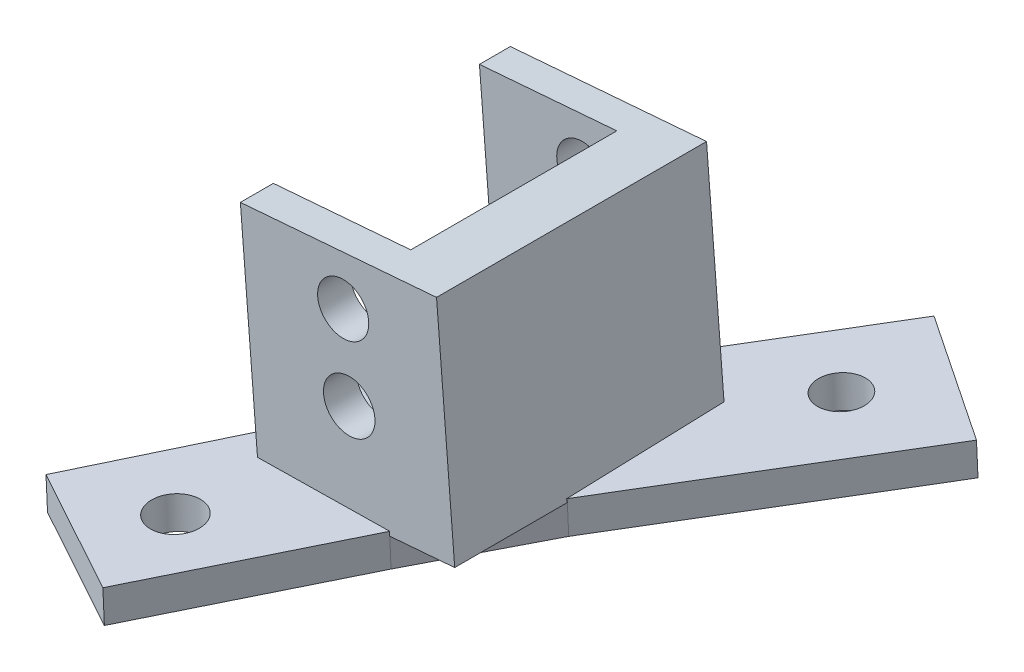
ISO-10303-21;
HEADER;
FILE_DESCRIPTION(('STEP AP214'),'2;1');
FILE_NAME('part.step','',(''),(''),'','','');
FILE_SCHEMA(('AUTOMOTIVE_DESIGN { 1 0 10303 214 1 1 1 1 }'));
ENDSEC;
DATA;
#1=APPLICATION_CONTEXT('core data for automotive mechanical design processes');
#2=APPLICATION_PROTOCOL_DEFINITION('international standard','automotive_design',2000,#1);
#3=PRODUCT_CONTEXT('',#1,'mechanical');
#4=PRODUCT('Part','Part','',(#3));
#5=PRODUCT_RELATED_PRODUCT_CATEGORY('part','',(#4));
#6=PRODUCT_DEFINITION_FORMATION('','',#4);
#7=PRODUCT_DEFINITION_CONTEXT('part definition',#1,'design');
#8=PRODUCT_DEFINITION('design','',#6,#7);
#9=PRODUCT_DEFINITION_SHAPE('','',#8);
#10=(LENGTH_UNIT() NAMED_UNIT(*) SI_UNIT(.MILLI.,.METRE.));
#11=(NAMED_UNIT(*) PLANE_ANGLE_UNIT() SI_UNIT($,.RADIAN.));
#12=(NAMED_UNIT(*) SI_UNIT($,.STERADIAN.) SOLID_ANGLE_UNIT());
#13=UNCERTAINTY_MEASURE_WITH_UNIT(LENGTH_MEASURE(1.E-05),#10,'distance_accuracy_value','');
#14=(GEOMETRIC_REPRESENTATION_CONTEXT(3) GLOBAL_UNCERTAINTY_ASSIGNED_CONTEXT((#13)) GLOBAL_UNIT_ASSIGNED_CONTEXT((#10,
#11,#12)) REPRESENTATION_CONTEXT('',''));
#15=CARTESIAN_POINT('',(0.,0.,0.));
#16=DIRECTION('',(0.,0.,1.));
#17=DIRECTION('',(1.,0.,0.));
#18=AXIS2_PLACEMENT_3D('',#15,#16,#17);
#19=CARTESIAN_POINT('',(-18.1904457725648,225.404163788834,-29.21));
#20=DIRECTION('',(0.0804399463844192,-0.996759456953217,0.));
#21=DIRECTION('',(0.996759456953217,0.0804399463844192,0.));
#22=AXIS2_PLACEMENT_3D('',#19,#20,#21);
#23=PLANE('',#22);
#24=DIRECTION('',(0.490806979567559,0.0396088412767035,-0.870367536446809));
#25=VECTOR('',#24,1.);
#26=CARTESIAN_POINT('',(-142.63849989162,215.361023760265,-99.8442643999821));
#27=LINE('',#26,#25);
#28=CARTESIAN_POINT('',(-196.807644056723,210.989494579443,-3.7839667246044));
#29=VERTEX_POINT('',#28);
#30=CARTESIAN_POINT('',(-182.469707413053,212.146587042258,-29.21));
#31=VERTEX_POINT('',#30);
#32=EDGE_CURVE('E292',#29,#31,#27,.T.);
#33=ORIENTED_EDGE('',*,*,#32,.F.);
#34=DIRECTION('',(0.,0.,1.));
#35=VECTOR('',#34,1.);
#36=CARTESIAN_POINT('',(-196.807644056723,210.989494579443,-29.21));
#37=LINE('',#36,#35);
#38=CARTESIAN_POINT('',(-196.807644056723,210.989494579443,-29.21));
#39=VERTEX_POINT('',#38);
#40=EDGE_CURVE('E389',#39,#29,#37,.T.);
#41=ORIENTED_EDGE('',*,*,#40,.F.);
#42=DIRECTION('',(0.996759456953217,0.0804399463844192,0.));
#43=VECTOR('',#42,1.);
#44=CARTESIAN_POINT('',(-18.1904457725648,225.404163788834,-29.21));
#45=LINE('',#44,#43);
#46=EDGE_CURVE('E360',#39,#31,#45,.T.);
#47=ORIENTED_EDGE('',*,*,#46,.T.);
#48=EDGE_LOOP('',(#33,#41,#47));
#49=FACE_BOUND('',#48,.T.);
#50=ADVANCED_FACE('F47',(#49),#23,.T.);
#51=CARTESIAN_POINT('',(-174.291632788432,229.541137280801,-29.21));
#52=DIRECTION('',(0.,0.,1.));
#53=DIRECTION('',(1.,0.,0.));
#54=AXIS2_PLACEMENT_3D('',#51,#52,#53);
#55=CYLINDRICAL_SURFACE('',#54,5.0800000000001);
#56=CARTESIAN_POINT('',(-174.291632788432,229.541137280801,-25.4000000000002));
#57=DIRECTION('',(0.,0.,1.));
#58=DIRECTION('',(0.,-1.,0.));
#59=AXIS2_PLACEMENT_3D('',#56,#57,#58);
#60=CIRCLE('',#59,5.08000000000002);
#61=CARTESIAN_POINT('',(-179.097761141606,231.186594740846,-25.4000000000002));
#62=VERTEX_POINT('',#61);
#63=CARTESIAN_POINT('',(-178.8037688076,227.207250277425,-25.4000000000002));
#64=VERTEX_POINT('',#63);
#65=EDGE_CURVE('E318',#62,#64,#60,.T.);
#66=ORIENTED_EDGE('',*,*,#65,.T.);
#67=DIRECTION('',(0.,0.,1.));
#68=VECTOR('',#67,1.);
#69=CARTESIAN_POINT('',(-178.8037688076,227.207250277425,-29.21));
#70=LINE('',#69,#68);
#71=CARTESIAN_POINT('',(-178.8037688076,227.207250277425,0.));
#72=VERTEX_POINT('',#71);
#73=EDGE_CURVE('E369',#64,#72,#70,.T.);
#74=ORIENTED_EDGE('',*,*,#73,.T.);
#75=CARTESIAN_POINT('',(-174.291632788432,229.541137280801,0.));
#76=DIRECTION('',(0.,0.,1.));
#77=DIRECTION('',(1.,0.,0.));
#78=AXIS2_PLACEMENT_3D('',#75,#76,#77);
#79=CIRCLE('',#78,5.0800000000001);
#80=CARTESIAN_POINT('',(-179.097761141606,231.186594740846,0.));
#81=VERTEX_POINT('',#80);
#82=EDGE_CURVE('E356',#81,#72,#79,.T.);
#83=ORIENTED_EDGE('',*,*,#82,.F.);
#84=DIRECTION('',(0.,0.,1.));
#85=VECTOR('',#84,1.);
#86=CARTESIAN_POINT('',(-179.097761141606,231.186594740846,-29.21));
#87=LINE('',#86,#85);
#88=EDGE_CURVE('E380',#62,#81,#87,.T.);
#89=ORIENTED_EDGE('',*,*,#88,.F.);
#90=EDGE_LOOP('',(#66,#74,#83,#89));
#91=FACE_BOUND('',#90,.T.);
#92=ADVANCED_FACE('F49',(#91),#55,.T.);
#93=CARTESIAN_POINT('',(-186.372442080017,233.677201969771,-29.21));
#94=DIRECTION('',(0.,0.,1.));
#95=DIRECTION('',(1.,0.,0.));
#96=AXIS2_PLACEMENT_3D('',#93,#94,#95);
#97=CYLINDRICAL_SURFACE('',#96,7.68922018961971);
#98=CARTESIAN_POINT('',(-186.372442080017,233.677201969771,-25.4000000000001));
#99=DIRECTION('',(0.,0.,1.));
#100=DIRECTION('',(0.,-1.,0.));
#101=AXIS2_PLACEMENT_3D('',#98,#99,#100);
#102=CIRCLE('',#101,7.68922018961969);
#103=CARTESIAN_POINT('',(-182.112910704482,240.07880329954,-25.4000000000001));
#104=VERTEX_POINT('',#103);
#105=EDGE_CURVE('E70',#104,#62,#102,.F.);
#106=ORIENTED_EDGE('',*,*,#105,.T.);
#107=ORIENTED_EDGE('',*,*,#88,.T.);
#108=CARTESIAN_POINT('',(-186.372442080017,233.677201969771,0.));
#109=DIRECTION('',(0.,0.,1.));
#110=DIRECTION('',(1.,0.,0.));
#111=AXIS2_PLACEMENT_3D('',#108,#109,#110);
#112=CIRCLE('',#111,7.68922018961971);
#113=CARTESIAN_POINT('',(-182.112910704482,240.07880329954,0.));
#114=VERTEX_POINT('',#113);
#115=EDGE_CURVE('E361',#114,#81,#112,.F.);
#116=ORIENTED_EDGE('',*,*,#115,.F.);
#117=DIRECTION('',(0.,0.,1.));
#118=VECTOR('',#117,1.);
#119=CARTESIAN_POINT('',(-182.112910704482,240.07880329954,-29.21));
#120=LINE('',#119,#118);
#121=EDGE_CURVE('E383',#104,#114,#120,.T.);
#122=ORIENTED_EDGE('',*,*,#121,.F.);
#123=EDGE_LOOP('',(#106,#107,#116,#122));
#124=FACE_BOUND('',#123,.T.);
#125=ADVANCED_FACE('F472',(#124),#97,.F.);
#126=CARTESIAN_POINT('',(-20.4277220013547,253.127034565074,-29.21));
#127=DIRECTION('',(-0.0804399463844192,0.996759456953217,0.));
#128=DIRECTION('',(-0.996759456953217,-0.0804399463844192,0.));
#129=AXIS2_PLACEMENT_3D('',#126,#127,#128);
#130=PLANE('',#129);
#131=DIRECTION('',(-0.996759456953217,-0.0804399463844192,0.));
#132=VECTOR('',#131,1.);
#133=CARTESIAN_POINT('',(-20.4277220013547,253.127034565074,-29.21));
#134=LINE('',#133,#132);
#135=CARTESIAN_POINT('',(-174.867675228012,240.663504401901,-29.21));
#136=VERTEX_POINT('',#135);
#137=CARTESIAN_POINT('',(-199.044920285513,238.712365355683,-29.21));
#138=VERTEX_POINT('',#137);
#139=EDGE_CURVE('E366',#136,#138,#134,.T.);
#140=ORIENTED_EDGE('',*,*,#139,.T.);
#141=DIRECTION('',(0.,0.,-1.));
#142=VECTOR('',#141,1.);
#143=CARTESIAN_POINT('',(-199.044920285513,238.712365355683,7.34351507594975));
#144=LINE('',#143,#142);
#145=CARTESIAN_POINT('',(-199.044920285513,238.712365355683,-25.4000000000002));
#146=VERTEX_POINT('',#145);
#147=EDGE_CURVE('E301',#146,#138,#144,.T.);
#148=ORIENTED_EDGE('',*,*,#147,.F.);
#149=DIRECTION('',(0.996759456953217,0.080439946384421,0.));
#150=VECTOR('',#149,1.);
#151=CARTESIAN_POINT('',(-199.044920285513,238.712365355683,-25.4000000000001));
#152=LINE('',#151,#150);
#153=EDGE_CURVE('E314',#146,#104,#152,.T.);
#154=ORIENTED_EDGE('',*,*,#153,.T.);
#155=ORIENTED_EDGE('',*,*,#121,.T.);
#156=DIRECTION('',(-0.996759456953217,-0.0804399463844201,0.));
#157=VECTOR('',#156,1.);
#158=CARTESIAN_POINT('',(-174.867675228012,240.663504401901,0.));
#159=LINE('',#158,#157);
#160=CARTESIAN_POINT('',(-199.044920285513,238.712365355683,0.));
#161=VERTEX_POINT('',#160);
#162=EDGE_CURVE('E334',#114,#161,#159,.T.);
#163=ORIENTED_EDGE('',*,*,#162,.T.);
#164=DIRECTION('',(0.,0.,-1.));
#165=VECTOR('',#164,1.);
#166=CARTESIAN_POINT('',(-199.044920285513,238.712365355683,4.06400000000001));
#167=LINE('',#166,#165);
#168=CARTESIAN_POINT('',(-199.044920285513,238.712365355683,4.06400000000001));
#169=VERTEX_POINT('',#168);
#170=EDGE_CURVE('E350',#169,#161,#167,.T.);
#171=ORIENTED_EDGE('',*,*,#170,.F.);
#172=DIRECTION('',(-0.996759456953217,-0.0804399463844201,0.));
#173=VECTOR('',#172,1.);
#174=CARTESIAN_POINT('',(-174.867675228012,240.663504401901,4.06400000000001));
#175=LINE('',#174,#173);
#176=CARTESIAN_POINT('',(-174.867675228012,240.663504401901,4.06400000000001));
#177=VERTEX_POINT('',#176);
#178=EDGE_CURVE('E337',#177,#169,#175,.T.);
#179=ORIENTED_EDGE('',*,*,#178,.F.);
#180=DIRECTION('',(0.,0.,1.));
#181=VECTOR('',#180,1.);
#182=CARTESIAN_POINT('',(-174.867675228012,240.663504401901,-29.21));
#183=LINE('',#182,#181);
#184=EDGE_CURVE('E385',#136,#177,#183,.T.);
#185=ORIENTED_EDGE('',*,*,#184,.F.);
#186=EDGE_LOOP('',(#140,#148,#154,#155,#163,#171,#179,#185));
#187=FACE_BOUND('',#186,.T.);
#188=ADVANCED_FACE('F423',(#187),#130,.T.);
#189=CARTESIAN_POINT('',(-154.439953226657,-12.463530163173,-29.21));
#190=DIRECTION('',(0.996759456953217,0.0804399463844184,0.));
#191=DIRECTION('',(-0.0804399463844184,0.996759456953217,0.));
#192=AXIS2_PLACEMENT_3D('',#189,#190,#191);
#193=PLANE('',#192);
#194=DIRECTION('',(0.0796348507072536,-0.986783235361383,-0.14112808707892));
#195=VECTOR('',#194,1.);
#196=CARTESIAN_POINT('',(-154.584338943718,-10.6743963385198,-41.8012951545538));
#197=LINE('',#196,#195);
#198=CARTESIAN_POINT('',(-172.664286142816,213.360541051816,-9.76019329983422));
#199=VERTEX_POINT('',#198);
#200=CARTESIAN_POINT('',(-172.630398999222,212.940633625661,-9.82024775726713));
#201=VERTEX_POINT('',#200);
#202=EDGE_CURVE('E290',#199,#201,#197,.T.);
#203=ORIENTED_EDGE('',*,*,#202,.F.);
#204=DIRECTION('',(-0.00245015527146717,0.0303607293093839,-0.999536003781228));
#205=VECTOR('',#204,1.);
#206=CARTESIAN_POINT('',(-172.695010957906,213.74126296153,-22.2943209325871));
#207=LINE('',#206,#205);
#208=CARTESIAN_POINT('',(-172.711963311257,213.951325489905,-29.21));
#209=VERTEX_POINT('',#208);
#210=EDGE_CURVE('E285',#199,#209,#207,.T.);
#211=ORIENTED_EDGE('',*,*,#210,.T.);
#212=DIRECTION('',(-0.0804399463844184,0.996759456953217,0.));
#213=VECTOR('',#212,1.);
#214=CARTESIAN_POINT('',(-154.439953226657,-12.463530163173,-29.21));
#215=LINE('',#214,#213);
#216=EDGE_CURVE('E364',#209,#136,#215,.T.);
#217=ORIENTED_EDGE('',*,*,#216,.T.);
#218=ORIENTED_EDGE('',*,*,#184,.T.);
#219=DIRECTION('',(-0.0804399463844174,0.996759456953217,0.));
#220=VECTOR('',#219,1.);
#221=CARTESIAN_POINT('',(-174.867675228012,240.663504401901,4.06400000000001));
#222=LINE('',#221,#220);
#223=CARTESIAN_POINT('',(-172.630398999222,212.940633625661,4.06400000000001));
#224=VERTEX_POINT('',#223);
#225=EDGE_CURVE('E347',#224,#177,#222,.T.);
#226=ORIENTED_EDGE('',*,*,#225,.F.);
#227=DIRECTION('',(0.,0.,1.));
#228=VECTOR('',#227,1.);
#229=CARTESIAN_POINT('',(-172.630398999222,212.940633625661,-29.21));
#230=LINE('',#229,#228);
#231=EDGE_CURVE('E387',#201,#224,#230,.T.);
#232=ORIENTED_EDGE('',*,*,#231,.F.);
#233=EDGE_LOOP('',(#203,#211,#217,#218,#226,#232));
#234=FACE_BOUND('',#233,.T.);
#235=ADVANCED_FACE('F429',(#234),#193,.T.);
#236=DIRECTION('',(-0.499124639494117,-0.0402800886010894,0.865593500849074));
#237=VECTOR('',#236,1.);
#238=CARTESIAN_POINT('',(-125.527776373539,216.74188418029,-91.5067059915503));
#239=LINE('',#238,#237);
#240=CARTESIAN_POINT('',(-180.636432027075,212.294535047834,4.06399999999908));
#241=VERTEX_POINT('',#240);
#242=EDGE_CURVE('E288',#201,#241,#239,.T.);
#243=ORIENTED_EDGE('',*,*,#242,.F.);
#244=ORIENTED_EDGE('',*,*,#231,.T.);
#245=DIRECTION('',(0.996759456953217,0.0804399463844203,0.));
#246=VECTOR('',#245,1.);
#247=CARTESIAN_POINT('',(-172.630398999222,212.940633625661,4.06400000000001));
#248=LINE('',#247,#246);
#249=EDGE_CURVE('E344',#241,#224,#248,.T.);
#250=ORIENTED_EDGE('',*,*,#249,.F.);
#251=EDGE_LOOP('',(#243,#244,#250));
#252=FACE_BOUND('',#251,.T.);
#253=ADVANCED_FACE('F449',(#252),#23,.T.);
#254=CARTESIAN_POINT('',(-178.617198284158,-14.4146692093909,-29.21));
#255=DIRECTION('',(-0.996759456953217,-0.0804399463844184,0.));
#256=DIRECTION('',(0.0804399463844184,-0.996759456953217,0.));
#257=AXIS2_PLACEMENT_3D('',#254,#255,#256);
#258=PLANE('',#257);
#259=DIRECTION('',(0.0796064885371079,-0.986431789809973,-0.143579702726688));
#260=VECTOR('',#259,1.);
#261=CARTESIAN_POINT('',(-178.701580300872,-13.3690621828223,-36.4403908351052));
#262=LINE('',#261,#260);
#263=CARTESIAN_POINT('',(-196.95275051512,212.787559361598,-3.52225009140992));
#264=VERTEX_POINT('',#263);
#265=EDGE_CURVE('E294',#264,#29,#262,.T.);
#266=ORIENTED_EDGE('',*,*,#265,.F.);
#267=DIRECTION('',(0.00245015527146717,-0.0303607293093839,0.999536003781228));
#268=VECTOR('',#267,1.);
#269=CARTESIAN_POINT('',(-196.998648981222,213.356303278062,-22.2464386853315));
#270=LINE('',#269,#268);
#271=CARTESIAN_POINT('',(-196.934154395939,212.557128356984,4.06400000000001));
#272=VERTEX_POINT('',#271);
#273=EDGE_CURVE('E265',#264,#272,#270,.T.);
#274=ORIENTED_EDGE('',*,*,#273,.T.);
#275=DIRECTION('',(0.0804399463844204,-0.996759456953217,0.));
#276=VECTOR('',#275,1.);
#277=CARTESIAN_POINT('',(-199.044920285513,238.712365355683,4.06400000000001));
#278=LINE('',#277,#276);
#279=EDGE_CURVE('E340',#169,#272,#278,.T.);
#280=ORIENTED_EDGE('',*,*,#279,.F.);
#281=ORIENTED_EDGE('',*,*,#170,.T.);
#282=DIRECTION('',(0.0804399463844204,-0.996759456953217,0.));
#283=VECTOR('',#282,1.);
#284=CARTESIAN_POINT('',(-199.044920285513,238.712365355683,0.));
#285=LINE('',#284,#283);
#286=CARTESIAN_POINT('',(-197.134551998829,215.040325012501,0.));
#287=VERTEX_POINT('',#286);
#288=EDGE_CURVE('E341',#161,#287,#285,.T.);
#289=ORIENTED_EDGE('',*,*,#288,.T.);
#290=DIRECTION('',(0.,0.,1.));
#291=VECTOR('',#290,1.);
#292=CARTESIAN_POINT('',(-197.134551998829,215.040325012501,-29.21));
#293=LINE('',#292,#291);
#294=CARTESIAN_POINT('',(-197.134551998829,215.040325012501,-25.4000000000002));
#295=VERTEX_POINT('',#294);
#296=EDGE_CURVE('E392',#295,#287,#293,.T.);
#297=ORIENTED_EDGE('',*,*,#296,.F.);
#298=DIRECTION('',(-0.080439946384421,0.996759456953217,0.));
#299=VECTOR('',#298,1.);
#300=CARTESIAN_POINT('',(-197.134551998829,215.040325012501,-25.4000000000002));
#301=LINE('',#300,#299);
#302=EDGE_CURVE('E311',#295,#146,#301,.T.);
#303=ORIENTED_EDGE('',*,*,#302,.T.);
#304=ORIENTED_EDGE('',*,*,#147,.T.);
#305=DIRECTION('',(0.0804399463844184,-0.996759456953217,0.));
#306=VECTOR('',#305,1.);
#307=CARTESIAN_POINT('',(-178.617198284158,-14.4146692093909,-29.21));
#308=LINE('',#307,#306);
#309=EDGE_CURVE('E357',#138,#39,#308,.T.);
#310=ORIENTED_EDGE('',*,*,#309,.T.);
#311=ORIENTED_EDGE('',*,*,#40,.T.);
#312=EDGE_LOOP('',(#266,#274,#280,#281,#289,#297,#303,#304,#310,#311));
#313=FACE_BOUND('',#312,.T.);
#314=ADVANCED_FACE('F410',(#313),#258,.T.);
#315=CARTESIAN_POINT('',(-18.5173537146711,229.454994221892,-29.21));
#316=DIRECTION('',(-0.0804399463844191,0.996759456953217,0.));
#317=DIRECTION('',(-0.996759456953217,-0.0804399463844191,0.));
#318=AXIS2_PLACEMENT_3D('',#315,#316,#317);
#319=PLANE('',#318);
#320=DIRECTION('',(-0.996759456953217,-0.0804399463844191,0.));
#321=VECTOR('',#320,1.);
#322=CARTESIAN_POINT('',(-184.947787901644,216.023814703759,-25.4000000000002));
#323=LINE('',#322,#321);
#324=CARTESIAN_POINT('',(-184.947787901644,216.023814703759,-25.4000000000002));
#325=VERTEX_POINT('',#324);
#326=EDGE_CURVE('E296',#325,#295,#323,.T.);
#327=ORIENTED_EDGE('',*,*,#326,.T.);
#328=ORIENTED_EDGE('',*,*,#296,.T.);
#329=DIRECTION('',(-0.996759456953217,-0.0804399463844191,0.));
#330=VECTOR('',#329,1.);
#331=CARTESIAN_POINT('',(-18.5173537146711,229.454994221892,0.));
#332=LINE('',#331,#330);
#333=CARTESIAN_POINT('',(-184.947787901644,216.023814703759,0.));
#334=VERTEX_POINT('',#333);
#335=EDGE_CURVE('E375',#334,#287,#332,.T.);
#336=ORIENTED_EDGE('',*,*,#335,.F.);
#337=DIRECTION('',(0.,0.,1.));
#338=VECTOR('',#337,1.);
#339=CARTESIAN_POINT('',(-184.947787901644,216.023814703759,-29.21));
#340=LINE('',#339,#338);
#341=EDGE_CURVE('E394',#325,#334,#340,.T.);
#342=ORIENTED_EDGE('',*,*,#341,.F.);
#343=EDGE_LOOP('',(#327,#328,#336,#342));
#344=FACE_BOUND('',#343,.T.);
#345=ADVANCED_FACE('F459',(#344),#319,.T.);
#346=CARTESIAN_POINT('',(-185.628460018152,223.677201969771,-29.21));
#347=DIRECTION('',(0.,0.,1.));
#348=DIRECTION('',(1.,0.,0.));
#349=AXIS2_PLACEMENT_3D('',#346,#347,#348);
#350=CYLINDRICAL_SURFACE('',#349,7.68359623963636);
#351=CARTESIAN_POINT('',(-185.628460018152,223.677201969771,-25.4000000000002));
#352=DIRECTION('',(0.,0.,1.));
#353=DIRECTION('',(0.,-1.,0.));
#354=AXIS2_PLACEMENT_3D('',#351,#352,#353);
#355=CIRCLE('',#354,7.68359623963636);
#356=EDGE_CURVE('E316',#64,#325,#355,.F.);
#357=ORIENTED_EDGE('',*,*,#356,.T.);
#358=ORIENTED_EDGE('',*,*,#341,.T.);
#359=CARTESIAN_POINT('',(-185.628460018152,223.677201969771,0.));
#360=DIRECTION('',(0.,0.,1.));
#361=DIRECTION('',(1.,0.,0.));
#362=AXIS2_PLACEMENT_3D('',#359,#360,#361);
#363=CIRCLE('',#362,7.68359623963636);
#364=EDGE_CURVE('E372',#72,#334,#363,.F.);
#365=ORIENTED_EDGE('',*,*,#364,.F.);
#366=ORIENTED_EDGE('',*,*,#73,.F.);
#367=EDGE_LOOP('',(#357,#358,#365,#366));
#368=FACE_BOUND('',#367,.T.);
#369=ADVANCED_FACE('F470',(#368),#350,.F.);
#370=CARTESIAN_POINT('',(0.,0.,-29.21));
#371=DIRECTION('',(0.,0.,1.));
#372=DIRECTION('',(1.,0.,0.));
#373=AXIS2_PLACEMENT_3D('',#370,#371,#372);
#374=PLANE('',#373);
#375=DIRECTION('',(0.999875524233858,0.0157777069965286,0.));
#376=VECTOR('',#375,1.);
#377=CARTESIAN_POINT('',(-3.41823536894268,216.622724850211,-29.21));
#378=LINE('',#377,#376);
#379=CARTESIAN_POINT('',(-182.46744772521,213.79738715362,-29.21));
#380=VERTEX_POINT('',#379);
#381=EDGE_CURVE('E283',#380,#209,#378,.T.);
#382=ORIENTED_EDGE('',*,*,#381,.F.);
#383=DIRECTION('',(-0.00136884272722212,-0.999999063134355,0.));
#384=VECTOR('',#383,1.);
#385=CARTESIAN_POINT('',(-182.75976055473,0.250169603439505,-29.21));
#386=LINE('',#385,#384);
#387=EDGE_CURVE('E11',#380,#31,#386,.T.);
#388=ORIENTED_EDGE('',*,*,#387,.T.);
#389=ORIENTED_EDGE('',*,*,#46,.F.);
#390=ORIENTED_EDGE('',*,*,#309,.F.);
#391=ORIENTED_EDGE('',*,*,#139,.F.);
#392=ORIENTED_EDGE('',*,*,#216,.F.);
#393=EDGE_LOOP('',(#382,#388,#389,#390,#391,#392));
#394=FACE_BOUND('',#393,.T.);
#395=CARTESIAN_POINT('',(-185.628460018152,223.677201969771,-29.21));
#396=DIRECTION('',(0.,0.,-1.));
#397=DIRECTION('',(-1.,0.,0.));
#398=AXIS2_PLACEMENT_3D('',#395,#396,#397);
#399=CIRCLE('',#398,3.175);
#400=CARTESIAN_POINT('',(-188.803460018152,223.677201969771,-29.21));
#401=VERTEX_POINT('',#400);
#402=EDGE_CURVE('E300',#401,#401,#399,.T.);
#403=ORIENTED_EDGE('',*,*,#402,.F.);
#404=EDGE_LOOP('',(#403));
#405=FACE_BOUND('',#404,.T.);
#406=CARTESIAN_POINT('',(-186.372442080017,233.677201969771,-29.21));
#407=DIRECTION('',(0.,0.,-1.));
#408=DIRECTION('',(-1.,0.,0.));
#409=AXIS2_PLACEMENT_3D('',#406,#407,#408);
#410=CIRCLE('',#409,3.15089605432129);
#411=CARTESIAN_POINT('',(-189.523338134339,233.677201969771,-29.21));
#412=VERTEX_POINT('',#411);
#413=EDGE_CURVE('E297',#412,#412,#410,.T.);
#414=ORIENTED_EDGE('',*,*,#413,.F.);
#415=EDGE_LOOP('',(#414));
#416=FACE_BOUND('',#415,.T.);
#417=ADVANCED_FACE('F416',(#394,#405,#416),#374,.F.);
#418=CARTESIAN_POINT('',(0.,0.,0.));
#419=DIRECTION('',(0.,0.,1.));
#420=DIRECTION('',(1.,0.,0.));
#421=AXIS2_PLACEMENT_3D('',#418,#419,#420);
#422=PLANE('',#421);
#423=CARTESIAN_POINT('',(-186.372442080017,233.677201969771,0.));
#424=DIRECTION('',(0.,0.,1.));
#425=DIRECTION('',(1.,0.,0.));
#426=AXIS2_PLACEMENT_3D('',#423,#424,#425);
#427=CIRCLE('',#426,3.15089605432123);
#428=CARTESIAN_POINT('',(-183.221546025696,233.677201969771,0.));
#429=VERTEX_POINT('',#428);
#430=EDGE_CURVE('E328',#429,#429,#427,.T.);
#431=ORIENTED_EDGE('',*,*,#430,.T.);
#432=EDGE_LOOP('',(#431));
#433=FACE_BOUND('',#432,.T.);
#434=CARTESIAN_POINT('',(-185.628460018152,223.677201969771,0.));
#435=DIRECTION('',(0.,0.,1.));
#436=DIRECTION('',(1.,0.,0.));
#437=AXIS2_PLACEMENT_3D('',#434,#435,#436);
#438=CIRCLE('',#437,3.17499999999994);
#439=CARTESIAN_POINT('',(-182.453460018152,223.677201969771,0.));
#440=VERTEX_POINT('',#439);
#441=EDGE_CURVE('E308',#440,#440,#438,.T.);
#442=ORIENTED_EDGE('',*,*,#441,.T.);
#443=EDGE_LOOP('',(#442));
#444=FACE_BOUND('',#443,.T.);
#445=ORIENTED_EDGE('',*,*,#364,.T.);
#446=ORIENTED_EDGE('',*,*,#335,.T.);
#447=ORIENTED_EDGE('',*,*,#288,.F.);
#448=ORIENTED_EDGE('',*,*,#162,.F.);
#449=ORIENTED_EDGE('',*,*,#115,.T.);
#450=ORIENTED_EDGE('',*,*,#82,.T.);
#451=EDGE_LOOP('',(#445,#446,#447,#448,#449,#450));
#452=FACE_BOUND('',#451,.T.);
#453=ADVANCED_FACE('F454',(#433,#444,#452),#422,.F.);
#454=CARTESIAN_POINT('',(0.,0.,4.06400000000001));
#455=DIRECTION('',(0.,0.,1.));
#456=DIRECTION('',(1.,0.,0.));
#457=AXIS2_PLACEMENT_3D('',#454,#455,#456);
#458=PLANE('',#457);
#459=DIRECTION('',(0.0017550915250467,0.999998459825683,0.));
#460=VECTOR('',#459,1.);
#461=CARTESIAN_POINT('',(-181.00847136973,0.317686923355913,4.06400000000001));
#462=LINE('',#461,#460);
#463=CARTESIAN_POINT('',(-180.635519763488,212.814315452219,4.06399999999999));
#464=VERTEX_POINT('',#463);
#465=EDGE_CURVE('E55',#241,#464,#462,.T.);
#466=ORIENTED_EDGE('',*,*,#465,.F.);
#467=ORIENTED_EDGE('',*,*,#249,.T.);
#468=ORIENTED_EDGE('',*,*,#225,.T.);
#469=ORIENTED_EDGE('',*,*,#178,.T.);
#470=ORIENTED_EDGE('',*,*,#279,.T.);
#471=DIRECTION('',(0.999875524233858,0.0157777069965286,0.));
#472=VECTOR('',#471,1.);
#473=CARTESIAN_POINT('',(-3.40227064948855,215.610997845966,4.06400000000001));
#474=LINE('',#473,#472);
#475=EDGE_CURVE('E382',#272,#464,#474,.T.);
#476=ORIENTED_EDGE('',*,*,#475,.T.);
#477=EDGE_LOOP('',(#466,#467,#468,#469,#470,#476));
#478=FACE_BOUND('',#477,.T.);
#479=CARTESIAN_POINT('',(-186.372442080017,233.677201969771,4.06400000000001));
#480=DIRECTION('',(0.,0.,1.));
#481=DIRECTION('',(1.,0.,0.));
#482=AXIS2_PLACEMENT_3D('',#479,#480,#481);
#483=CIRCLE('',#482,3.15089605432123);
#484=CARTESIAN_POINT('',(-183.221546025696,233.677201969771,4.06400000000001));
#485=VERTEX_POINT('',#484);
#486=EDGE_CURVE('E331',#485,#485,#483,.T.);
#487=ORIENTED_EDGE('',*,*,#486,.F.);
#488=EDGE_LOOP('',(#487));
#489=FACE_BOUND('',#488,.T.);
#490=CARTESIAN_POINT('',(-185.628460018152,223.677201969771,4.06400000000001));
#491=DIRECTION('',(0.,0.,1.));
#492=DIRECTION('',(1.,0.,0.));
#493=AXIS2_PLACEMENT_3D('',#490,#491,#492);
#494=CIRCLE('',#493,3.17499999999994);
#495=CARTESIAN_POINT('',(-182.453460018152,223.677201969771,4.06400000000001));
#496=VERTEX_POINT('',#495);
#497=EDGE_CURVE('E325',#496,#496,#494,.T.);
#498=ORIENTED_EDGE('',*,*,#497,.F.);
#499=EDGE_LOOP('',(#498));
#500=FACE_BOUND('',#499,.T.);
#501=ADVANCED_FACE('F404',(#478,#489,#500),#458,.T.);
#502=CARTESIAN_POINT('',(-186.372442080017,233.677201969771,4.06400000000001));
#503=DIRECTION('',(0.,0.,-1.));
#504=DIRECTION('',(-1.,0.,0.));
#505=AXIS2_PLACEMENT_3D('',#502,#503,#504);
#506=CYLINDRICAL_SURFACE('',#505,3.15089605432123);
#507=ORIENTED_EDGE('',*,*,#486,.T.);
#508=EDGE_LOOP('',(#507));
#509=FACE_BOUND('',#508,.T.);
#510=ORIENTED_EDGE('',*,*,#430,.F.);
#511=EDGE_LOOP('',(#510));
#512=FACE_BOUND('',#511,.T.);
#513=ADVANCED_FACE('F542',(#509,#512),#506,.F.);
#514=CARTESIAN_POINT('',(-185.628460018152,223.677201969771,4.06400000000001));
#515=DIRECTION('',(0.,0.,-1.));
#516=DIRECTION('',(-1.,0.,0.));
#517=AXIS2_PLACEMENT_3D('',#514,#515,#516);
#518=CYLINDRICAL_SURFACE('',#517,3.17499999999994);
#519=ORIENTED_EDGE('',*,*,#497,.T.);
#520=EDGE_LOOP('',(#519));
#521=FACE_BOUND('',#520,.T.);
#522=ORIENTED_EDGE('',*,*,#441,.F.);
#523=EDGE_LOOP('',(#522));
#524=FACE_BOUND('',#523,.T.);
#525=ADVANCED_FACE('F552',(#521,#524),#518,.F.);
#526=CARTESIAN_POINT('',(-186.372442080017,233.677201969771,7.34351507594975));
#527=DIRECTION('',(0.,0.,-1.));
#528=DIRECTION('',(-1.,0.,0.));
#529=AXIS2_PLACEMENT_3D('',#526,#527,#528);
#530=CYLINDRICAL_SURFACE('',#529,3.15089605432129);
#531=ORIENTED_EDGE('',*,*,#413,.T.);
#532=EDGE_LOOP('',(#531));
#533=FACE_BOUND('',#532,.T.);
#534=CARTESIAN_POINT('',(-186.372442080017,233.677201969771,-25.4000000000001));
#535=DIRECTION('',(0.,0.,1.));
#536=DIRECTION('',(0.,-1.,0.));
#537=AXIS2_PLACEMENT_3D('',#534,#535,#536);
#538=CIRCLE('',#537,3.15089605432129);
#539=CARTESIAN_POINT('',(-186.372442080017,230.52630591545,-25.4000000000001));
#540=VERTEX_POINT('',#539);
#541=EDGE_CURVE('E305',#540,#540,#538,.F.);
#542=ORIENTED_EDGE('',*,*,#541,.F.);
#543=EDGE_LOOP('',(#542));
#544=FACE_BOUND('',#543,.T.);
#545=ADVANCED_FACE('F561',(#533,#544),#530,.F.);
#546=CARTESIAN_POINT('',(-185.628460018152,223.677201969771,7.34351507594975));
#547=DIRECTION('',(0.,0.,-1.));
#548=DIRECTION('',(-1.,0.,0.));
#549=AXIS2_PLACEMENT_3D('',#546,#547,#548);
#550=CYLINDRICAL_SURFACE('',#549,3.175);
#551=ORIENTED_EDGE('',*,*,#402,.T.);
#552=EDGE_LOOP('',(#551));
#553=FACE_BOUND('',#552,.T.);
#554=CARTESIAN_POINT('',(-185.628460018152,223.677201969771,-25.4000000000002));
#555=DIRECTION('',(0.,0.,1.));
#556=DIRECTION('',(0.,-1.,0.));
#557=AXIS2_PLACEMENT_3D('',#554,#555,#556);
#558=CIRCLE('',#557,3.175);
#559=CARTESIAN_POINT('',(-185.628460018152,220.502201969771,-25.4000000000002));
#560=VERTEX_POINT('',#559);
#561=EDGE_CURVE('E304',#560,#560,#558,.F.);
#562=ORIENTED_EDGE('',*,*,#561,.F.);
#563=EDGE_LOOP('',(#562));
#564=FACE_BOUND('',#563,.T.);
#565=ADVANCED_FACE('F586',(#553,#564),#550,.F.);
#566=CARTESIAN_POINT('',(-216.877505131564,216.581396830599,-25.4000000000002));
#567=DIRECTION('',(0.,0.,1.));
#568=DIRECTION('',(-0.999875524233858,-0.015777706996527,0.));
#569=AXIS2_PLACEMENT_3D('',#566,#567,#568);
#570=PLANE('',#569);
#571=ORIENTED_EDGE('',*,*,#326,.F.);
#572=ORIENTED_EDGE('',*,*,#356,.F.);
#573=ORIENTED_EDGE('',*,*,#65,.F.);
#574=ORIENTED_EDGE('',*,*,#105,.F.);
#575=ORIENTED_EDGE('',*,*,#153,.F.);
#576=ORIENTED_EDGE('',*,*,#302,.F.);
#577=EDGE_LOOP('',(#571,#572,#573,#574,#575,#576));
#578=FACE_BOUND('',#577,.T.);
#579=ORIENTED_EDGE('',*,*,#561,.T.);
#580=EDGE_LOOP('',(#579));
#581=FACE_BOUND('',#580,.T.);
#582=ORIENTED_EDGE('',*,*,#541,.T.);
#583=EDGE_LOOP('',(#582));
#584=FACE_BOUND('',#583,.T.);
#585=ADVANCED_FACE('F463',(#578,#581,#584),#570,.T.);
#586=CARTESIAN_POINT('',(-172.572963471863,209.300790520403,-9.9309481390332));
#587=DIRECTION('',(0.86632617863636,-0.00152048407586129,0.499476366145083));
#588=DIRECTION('',(0.499476943508753,0.,-0.866327180055638));
#589=AXIS2_PLACEMENT_3D('',#586,#587,#588);
#590=PLANE('',#589);
#591=DIRECTION('',(0.499229652727486,0.0342095125264331,-0.865794122808822));
#592=VECTOR('',#591,1.);
#593=CARTESIAN_POINT('',(-172.63705444585,213.362407092972,-9.80742014835655));
#594=LINE('',#593,#592);
#595=CARTESIAN_POINT('',(-172.63705444585,213.362407092972,-9.80742014835655));
#596=VERTEX_POINT('',#595);
#597=EDGE_CURVE('E257',#199,#596,#594,.T.);
#598=ORIENTED_EDGE('',*,*,#597,.F.);
#599=ORIENTED_EDGE('',*,*,#202,.T.);
#600=DIRECTION('',(-0.0157704168275928,0.999413526714982,0.0303956669972081));
#601=VECTOR('',#600,1.);
#602=CARTESIAN_POINT('',(-172.572963471863,209.300790520403,-9.9309481390332));
#603=LINE('',#602,#601);
#604=EDGE_CURVE('E273',#201,#596,#603,.T.);
#605=ORIENTED_EDGE('',*,*,#604,.T.);
#606=EDGE_LOOP('',(#598,#599,#605));
#607=FACE_BOUND('',#606,.T.);
#608=ADVANCED_FACE('F439',(#607),#590,.T.);
#609=CARTESIAN_POINT('',(-172.572963471863,209.300790520403,-9.9309481390332));
#610=VERTEX_POINT('',#609);
#611=EDGE_CURVE('E270',#610,#201,#603,.T.);
#612=ORIENTED_EDGE('',*,*,#611,.T.);
#613=ORIENTED_EDGE('',*,*,#242,.T.);
#614=DIRECTION('',(-0.0157704168275928,0.999413526714982,0.0303956669972081));
#615=VECTOR('',#614,1.);
#616=CARTESIAN_POINT('',(-180.580533172426,208.752075005447,3.95626137837548));
#617=LINE('',#616,#615);
#618=CARTESIAN_POINT('',(-180.580533172426,208.752075005447,3.95626137837548));
#619=VERTEX_POINT('',#618);
#620=EDGE_CURVE('E274',#619,#241,#617,.T.);
#621=ORIENTED_EDGE('',*,*,#620,.F.);
#622=DIRECTION('',(0.499229652727486,0.0342095125264331,-0.865794122808822));
#623=VECTOR('',#622,1.);
#624=CARTESIAN_POINT('',(-172.572963471863,209.300790520403,-9.9309481390332));
#625=LINE('',#624,#623);
#626=EDGE_CURVE('E237',#619,#610,#625,.T.);
#627=ORIENTED_EDGE('',*,*,#626,.T.);
#628=EDGE_LOOP('',(#612,#613,#621,#627));
#629=FACE_BOUND('',#628,.T.);
#630=ADVANCED_FACE('F446',(#629),#590,.T.);
#631=CARTESIAN_POINT('',(-3.40107539120062,215.535251128937,6.55518215868913));
#632=DIRECTION('',(0.0157704168275933,-0.999413526714982,-0.0303956669972074));
#633=DIRECTION('',(0.,0.0303994474954877,-0.999537829995428));
#634=AXIS2_PLACEMENT_3D('',#631,#632,#633);
#635=PLANE('',#634);
#636=ORIENTED_EDGE('',*,*,#210,.F.);
#637=ORIENTED_EDGE('',*,*,#597,.T.);
#638=DIRECTION('',(0.555450528865871,0.0340339718444957,-0.830852814127215));
#639=VECTOR('',#638,1.);
#640=CARTESIAN_POINT('',(-152.427389572631,214.600708488933,-40.0373975448433));
#641=LINE('',#640,#639);
#642=CARTESIAN_POINT('',(-152.427389572631,214.600708488933,-40.0373975448433));
#643=VERTEX_POINT('',#642);
#644=EDGE_CURVE('E259',#596,#643,#641,.T.);
#645=ORIENTED_EDGE('',*,*,#644,.T.);
#646=DIRECTION('',(-0.831400026422725,0.00378039410766583,-0.555661501891829));
#647=VECTOR('',#646,1.);
#648=CARTESIAN_POINT('',(-168.209139987227,214.672468453307,-50.5850411089029));
#649=LINE('',#648,#647);
#650=CARTESIAN_POINT('',(-168.209139987227,214.672468453307,-50.5850411089029));
#651=VERTEX_POINT('',#650);
#652=EDGE_CURVE('E227',#643,#651,#649,.T.);
#653=ORIENTED_EDGE('',*,*,#652,.T.);
#654=DIRECTION('',(-0.555450528865872,-0.0340339718444958,0.830852814127214));
#655=VECTOR('',#654,1.);
#656=CARTESIAN_POINT('',(-182.297351645706,213.809245224583,-29.5116426797638));
#657=LINE('',#656,#655);
#658=CARTESIAN_POINT('',(-182.297351645706,213.809245224583,-29.5116426797638));
#659=VERTEX_POINT('',#658);
#660=EDGE_CURVE('E224',#651,#659,#657,.T.);
#661=ORIENTED_EDGE('',*,*,#660,.T.);
#662=DIRECTION('',(-0.490899112609827,-0.034222520176644,0.87054401402321));
#663=VECTOR('',#662,1.);
#664=CARTESIAN_POINT('',(-182.297351645706,213.809245224583,-29.5116426797638));
#665=LINE('',#664,#663);
#666=EDGE_CURVE('E247',#659,#380,#665,.T.);
#667=ORIENTED_EDGE('',*,*,#666,.T.);
#668=ORIENTED_EDGE('',*,*,#381,.T.);
#669=EDGE_LOOP('',(#636,#637,#645,#653,#661,#667,#668));
#670=FACE_BOUND('',#669,.T.);
#671=CARTESIAN_POINT('',(-166.169608657409,214.295534517927,-37.1332180928699));
#672=DIRECTION('',(-0.0157704168275928,0.999413526714982,0.0303956669972081));
#673=DIRECTION('',(0.,-0.0303994474954885,0.999537829995428));
#674=AXIS2_PLACEMENT_3D('',#671,#672,#673);
#675=CIRCLE('',#674,2.91211434745146);
#676=CARTESIAN_POINT('',(-166.169608657409,214.20700785072,-34.2224496373197));
#677=VERTEX_POINT('',#676);
#678=EDGE_CURVE('E773',#677,#677,#675,.T.);
#679=ORIENTED_EDGE('',*,*,#678,.F.);
#680=EDGE_LOOP('',(#679));
#681=FACE_BOUND('',#680,.T.);
#682=ADVANCED_FACE('F435',(#670,#681),#635,.F.);
#683=CARTESIAN_POINT('',(-182.233260671718,209.747628652013,-29.6351706704405));
#684=DIRECTION('',(-0.871073679542648,0.00119236398820142,-0.491150916802719));
#685=DIRECTION('',(-0.491151265945549,0.,0.871074298759919));
#686=AXIS2_PLACEMENT_3D('',#683,#684,#685);
#687=PLANE('',#686);
#688=CARTESIAN_POINT('',(-197.915990177884,212.72040811209,-1.81407319528463));
#689=VERTEX_POINT('',#688);
#690=EDGE_CURVE('E250',#264,#689,#665,.T.);
#691=ORIENTED_EDGE('',*,*,#690,.F.);
#692=ORIENTED_EDGE('',*,*,#265,.T.);
#693=ORIENTED_EDGE('',*,*,#32,.T.);
#694=ORIENTED_EDGE('',*,*,#387,.F.);
#695=ORIENTED_EDGE('',*,*,#666,.F.);
#696=DIRECTION('',(-0.0157704168275928,0.999413526714982,0.0303956669972081));
#697=VECTOR('',#696,1.);
#698=CARTESIAN_POINT('',(-182.233260671718,209.747628652013,-29.6351706704405));
#699=LINE('',#698,#697);
#700=CARTESIAN_POINT('',(-182.233260671718,209.747628652013,-29.6351706704405));
#701=VERTEX_POINT('',#700);
#702=EDGE_CURVE('E223',#701,#659,#699,.T.);
#703=ORIENTED_EDGE('',*,*,#702,.F.);
#704=DIRECTION('',(-0.490899112609827,-0.034222520176644,0.87054401402321));
#705=VECTOR('',#704,1.);
#706=CARTESIAN_POINT('',(-182.233260671718,209.747628652013,-29.6351706704405));
#707=LINE('',#706,#705);
#708=CARTESIAN_POINT('',(-197.851899203896,208.658791539521,-1.93760118596128));
#709=VERTEX_POINT('',#708);
#710=EDGE_CURVE('E215',#701,#709,#707,.T.);
#711=ORIENTED_EDGE('',*,*,#710,.T.);
#712=DIRECTION('',(-0.0157704168275928,0.999413526714982,0.0303956669972081));
#713=VECTOR('',#712,1.);
#714=CARTESIAN_POINT('',(-197.851899203896,208.658791539521,-1.93760118596128));
#715=LINE('',#714,#713);
#716=EDGE_CURVE('E198',#709,#689,#715,.T.);
#717=ORIENTED_EDGE('',*,*,#716,.T.);
#718=EDGE_LOOP('',(#691,#692,#693,#694,#695,#703,#711,#717));
#719=FACE_BOUND('',#718,.T.);
#720=ADVANCED_FACE('F221',(#719),#687,.T.);
#721=CARTESIAN_POINT('',(-182.233260671718,209.747628652013,-29.6351706704405));
#722=DIRECTION('',(-0.831400026422725,0.00378039410766551,-0.555661501891829));
#723=DIRECTION('',(-0.555665472519118,0.,0.831405967413096));
#724=AXIS2_PLACEMENT_3D('',#721,#722,#723);
#725=PLANE('',#724);
#726=ORIENTED_EDGE('',*,*,#660,.F.);
#727=DIRECTION('',(-0.0157704168275928,0.999413526714982,0.0303956669972081));
#728=VECTOR('',#727,1.);
#729=CARTESIAN_POINT('',(-168.14504901324,210.610851880737,-50.7085690995795));
#730=LINE('',#729,#728);
#731=CARTESIAN_POINT('',(-168.14504901324,210.610851880737,-50.7085690995795));
#732=VERTEX_POINT('',#731);
#733=EDGE_CURVE('E266',#732,#651,#730,.T.);
#734=ORIENTED_EDGE('',*,*,#733,.F.);
#735=DIRECTION('',(-0.555450528865872,-0.0340339718444958,0.830852814127214));
#736=VECTOR('',#735,1.);
#737=CARTESIAN_POINT('',(-182.233260671718,209.747628652013,-29.6351706704405));
#738=LINE('',#737,#736);
#739=EDGE_CURVE('E208',#732,#701,#738,.T.);
#740=ORIENTED_EDGE('',*,*,#739,.T.);
#741=ORIENTED_EDGE('',*,*,#702,.T.);
#742=EDGE_LOOP('',(#726,#734,#740,#741));
#743=FACE_BOUND('',#742,.T.);
#744=ADVANCED_FACE('F640',(#743),#725,.T.);
#745=CARTESIAN_POINT('',(-168.14504901324,210.610851880737,-50.7085690995795));
#746=DIRECTION('',(0.555450528865871,0.0340339718444956,-0.830852814127215));
#747=DIRECTION('',(-0.831334425636134,0.,-0.555772500896041));
#748=AXIS2_PLACEMENT_3D('',#745,#746,#747);
#749=PLANE('',#748);
#750=ORIENTED_EDGE('',*,*,#652,.F.);
#751=DIRECTION('',(-0.0157704168275928,0.999413526714982,0.0303956669972081));
#752=VECTOR('',#751,1.);
#753=CARTESIAN_POINT('',(-152.363298598644,210.539091916364,-40.16092553552));
#754=LINE('',#753,#752);
#755=CARTESIAN_POINT('',(-152.363298598644,210.539091916364,-40.16092553552));
#756=VERTEX_POINT('',#755);
#757=EDGE_CURVE('E268',#756,#643,#754,.T.);
#758=ORIENTED_EDGE('',*,*,#757,.F.);
#759=DIRECTION('',(-0.831400026422725,0.00378039410766583,-0.555661501891829));
#760=VECTOR('',#759,1.);
#761=CARTESIAN_POINT('',(-168.14504901324,210.610851880737,-50.7085690995795));
#762=LINE('',#761,#760);
#763=EDGE_CURVE('E243',#756,#732,#762,.T.);
#764=ORIENTED_EDGE('',*,*,#763,.T.);
#765=ORIENTED_EDGE('',*,*,#733,.T.);
#766=EDGE_LOOP('',(#750,#758,#764,#765));
#767=FACE_BOUND('',#766,.T.);
#768=ADVANCED_FACE('F649',(#767),#749,.T.);
#769=CARTESIAN_POINT('',(-152.363298598644,210.539091916364,-40.16092553552));
#770=DIRECTION('',(0.831400026422725,-0.00378039410766548,0.555661501891829));
#771=DIRECTION('',(0.555665472519117,0.,-0.831405967413096));
#772=AXIS2_PLACEMENT_3D('',#769,#770,#771);
#773=PLANE('',#772);
#774=ORIENTED_EDGE('',*,*,#644,.F.);
#775=ORIENTED_EDGE('',*,*,#604,.F.);
#776=ORIENTED_EDGE('',*,*,#611,.F.);
#777=DIRECTION('',(0.555450528865871,0.0340339718444957,-0.830852814127215));
#778=VECTOR('',#777,1.);
#779=CARTESIAN_POINT('',(-152.363298598644,210.539091916364,-40.16092553552));
#780=LINE('',#779,#778);
#781=EDGE_CURVE('E240',#610,#756,#780,.T.);
#782=ORIENTED_EDGE('',*,*,#781,.T.);
#783=ORIENTED_EDGE('',*,*,#757,.T.);
#784=EDGE_LOOP('',(#774,#775,#776,#782,#783));
#785=FACE_BOUND('',#784,.T.);
#786=ADVANCED_FACE('F442',(#785),#773,.T.);
#787=CARTESIAN_POINT('',(-180.644624146413,212.813691578016,4.07978936905214));
#788=VERTEX_POINT('',#787);
#789=EDGE_CURVE('E277',#241,#788,#617,.T.);
#790=ORIENTED_EDGE('',*,*,#789,.F.);
#791=ORIENTED_EDGE('',*,*,#465,.T.);
#792=EDGE_CURVE('E62',#788,#464,#594,.T.);
#793=ORIENTED_EDGE('',*,*,#792,.F.);
#794=EDGE_LOOP('',(#790,#791,#793));
#795=FACE_BOUND('',#794,.T.);
#796=ADVANCED_FACE('F401',(#795),#590,.T.);
#797=CARTESIAN_POINT('',(-180.580533172426,208.752075005447,3.95626137837548));
#798=DIRECTION('',(0.876278056817528,-0.000825999397916034,0.481805027853686));
#799=DIRECTION('',(0.481805192215534,0.,-0.87627835574899));
#800=AXIS2_PLACEMENT_3D('',#797,#798,#799);
#801=PLANE('',#800);
#802=DIRECTION('',(0.481547568878901,0.0342333221308685,-0.875751116792154));
#803=VECTOR('',#802,1.);
#804=CARTESIAN_POINT('',(-180.644624146413,212.813691578016,4.07978936905214));
#805=LINE('',#804,#803);
#806=CARTESIAN_POINT('',(-193.17965731693,211.922573324743,26.8762273692758));
#807=VERTEX_POINT('',#806);
#808=EDGE_CURVE('E255',#807,#788,#805,.T.);
#809=ORIENTED_EDGE('',*,*,#808,.F.);
#810=DIRECTION('',(-0.0157704168275928,0.999413526714982,0.0303956669972081));
#811=VECTOR('',#810,1.);
#812=CARTESIAN_POINT('',(-193.115566342942,207.860956752173,26.7526993785991));
#813=LINE('',#812,#811);
#814=CARTESIAN_POINT('',(-193.115566342942,207.860956752173,26.7526993785991));
#815=VERTEX_POINT('',#814);
#816=EDGE_CURVE('E278',#815,#807,#813,.T.);
#817=ORIENTED_EDGE('',*,*,#816,.F.);
#818=DIRECTION('',(0.481547568878901,0.0342333221308685,-0.875751116792154));
#819=VECTOR('',#818,1.);
#820=CARTESIAN_POINT('',(-180.580533172426,208.752075005447,3.95626137837548));
#821=LINE('',#820,#819);
#822=EDGE_CURVE('E234',#815,#619,#821,.T.);
#823=ORIENTED_EDGE('',*,*,#822,.T.);
#824=ORIENTED_EDGE('',*,*,#620,.T.);
#825=ORIENTED_EDGE('',*,*,#789,.T.);
#826=EDGE_LOOP('',(#809,#817,#823,#824,#825));
#827=FACE_BOUND('',#826,.T.);
#828=ADVANCED_FACE('F676',(#827),#801,.T.);
#829=CARTESIAN_POINT('',(-193.115566342942,207.860956752173,26.7526993785991));
#830=DIRECTION('',(-0.481547568878901,-0.0342333221308688,0.875751116792153));
#831=DIRECTION('',(0.87626472354099,0.,0.481829984826218));
#832=AXIS2_PLACEMENT_3D('',#829,#830,#831);
#833=PLANE('',#832);
#834=DIRECTION('',(0.876278056817528,-0.000825999397915233,0.481805027853686));
#835=VECTOR('',#834,1.);
#836=CARTESIAN_POINT('',(-193.17965731693,211.922573324743,26.8762273692758));
#837=LINE('',#836,#835);
#838=CARTESIAN_POINT('',(-208.744567870609,211.93724515938,18.3181537024634));
#839=VERTEX_POINT('',#838);
#840=EDGE_CURVE('E252',#839,#807,#837,.T.);
#841=ORIENTED_EDGE('',*,*,#840,.F.);
#842=DIRECTION('',(-0.0157704168275928,0.999413526714982,0.0303956669972081));
#843=VECTOR('',#842,1.);
#844=CARTESIAN_POINT('',(-208.680476896622,207.875628586811,18.1946257117867));
#845=LINE('',#844,#843);
#846=CARTESIAN_POINT('',(-208.680476896622,207.875628586811,18.1946257117867));
#847=VERTEX_POINT('',#846);
#848=EDGE_CURVE('E207',#847,#839,#845,.T.);
#849=ORIENTED_EDGE('',*,*,#848,.F.);
#850=DIRECTION('',(0.876278056817528,-0.000825999397915233,0.481805027853686));
#851=VECTOR('',#850,1.);
#852=CARTESIAN_POINT('',(-193.115566342942,207.860956752173,26.7526993785991));
#853=LINE('',#852,#851);
#854=EDGE_CURVE('E219',#847,#815,#853,.T.);
#855=ORIENTED_EDGE('',*,*,#854,.T.);
#856=ORIENTED_EDGE('',*,*,#816,.T.);
#857=EDGE_LOOP('',(#841,#849,#855,#856));
#858=FACE_BOUND('',#857,.T.);
#859=ADVANCED_FACE('F684',(#858),#833,.T.);
#860=CARTESIAN_POINT('',(-208.680476896622,207.875628586811,18.1946257117867));
#861=DIRECTION('',(-0.880695586140599,0.00050925495892752,-0.473682409650025));
#862=DIRECTION('',(-0.47368247107258,0.,0.880695700340688));
#863=AXIS2_PLACEMENT_3D('',#860,#861,#862);
#864=PLANE('',#863);
#865=DIRECTION('',(-0.47342008671533,-0.0342394988063206,0.880171050544121));
#866=VECTOR('',#865,1.);
#867=CARTESIAN_POINT('',(-208.744567870609,211.93724515938,18.3181537024634));
#868=LINE('',#867,#866);
#869=EDGE_CURVE('E203',#689,#839,#868,.T.);
#870=ORIENTED_EDGE('',*,*,#869,.F.);
#871=ORIENTED_EDGE('',*,*,#716,.F.);
#872=DIRECTION('',(-0.47342008671533,-0.0342394988063206,0.880171050544121));
#873=VECTOR('',#872,1.);
#874=CARTESIAN_POINT('',(-208.680476896622,207.875628586811,18.1946257117867));
#875=LINE('',#874,#873);
#876=EDGE_CURVE('E201',#709,#847,#875,.T.);
#877=ORIENTED_EDGE('',*,*,#876,.T.);
#878=ORIENTED_EDGE('',*,*,#848,.T.);
#879=EDGE_LOOP('',(#870,#871,#877,#878));
#880=FACE_BOUND('',#879,.T.);
#881=ADVANCED_FACE('F200',(#880),#864,.T.);
#882=CARTESIAN_POINT('',(-3.33698441721328,211.473634556367,6.43165416801248));
#883=DIRECTION('',(0.0157704168275933,-0.999413526714982,-0.0303956669972074));
#884=DIRECTION('',(0.,0.0303994474954877,-0.999537829995428));
#885=AXIS2_PLACEMENT_3D('',#882,#883,#884);
#886=PLANE('',#885);
#887=CARTESIAN_POINT('',(-166.105517683422,210.233917945357,-37.2567460835465));
#888=DIRECTION('',(-0.0157704168275928,0.999413526714982,0.0303956669972081));
#889=DIRECTION('',(0.,-0.0303994474954885,0.999537829995428));
#890=AXIS2_PLACEMENT_3D('',#887,#888,#889);
#891=CIRCLE('',#890,2.91211434745146);
#892=CARTESIAN_POINT('',(-166.105517683422,210.145391278151,-34.3459776279963));
#893=VERTEX_POINT('',#892);
#894=EDGE_CURVE('E770',#893,#893,#891,.T.);
#895=ORIENTED_EDGE('',*,*,#894,.T.);
#896=EDGE_LOOP('',(#895));
#897=FACE_BOUND('',#896,.T.);
#898=CARTESIAN_POINT('',(-196.183313842996,208.177914661467,14.7394187100621));
#899=DIRECTION('',(-0.0157704168275928,0.999413526714982,0.0303956669972081));
#900=DIRECTION('',(0.,-0.0303994474954885,0.999537829995428));
#901=AXIS2_PLACEMENT_3D('',#898,#899,#900);
#902=CIRCLE('',#901,3.03524844128208);
#903=CARTESIAN_POINT('',(-196.183313842996,208.08564478584,17.7732643505582));
#904=VERTEX_POINT('',#903);
#905=EDGE_CURVE('E776',#904,#904,#902,.T.);
#906=ORIENTED_EDGE('',*,*,#905,.T.);
#907=EDGE_LOOP('',(#906));
#908=FACE_BOUND('',#907,.T.);
#909=ORIENTED_EDGE('',*,*,#710,.F.);
#910=ORIENTED_EDGE('',*,*,#739,.F.);
#911=ORIENTED_EDGE('',*,*,#763,.F.);
#912=ORIENTED_EDGE('',*,*,#781,.F.);
#913=ORIENTED_EDGE('',*,*,#626,.F.);
#914=ORIENTED_EDGE('',*,*,#822,.F.);
#915=ORIENTED_EDGE('',*,*,#854,.F.);
#916=ORIENTED_EDGE('',*,*,#876,.F.);
#917=EDGE_LOOP('',(#909,#910,#911,#912,#913,#914,#915,#916));
#918=FACE_BOUND('',#917,.T.);
#919=ADVANCED_FACE('F213',(#897,#908,#918),#886,.T.);
#920=ORIENTED_EDGE('',*,*,#273,.F.);
#921=ORIENTED_EDGE('',*,*,#690,.T.);
#922=ORIENTED_EDGE('',*,*,#869,.T.);
#923=ORIENTED_EDGE('',*,*,#840,.T.);
#924=ORIENTED_EDGE('',*,*,#808,.T.);
#925=ORIENTED_EDGE('',*,*,#792,.T.);
#926=ORIENTED_EDGE('',*,*,#475,.F.);
#927=EDGE_LOOP('',(#920,#921,#922,#923,#924,#925,#926));
#928=FACE_BOUND('',#927,.T.);
#929=CARTESIAN_POINT('',(-196.247404816983,212.239531234036,14.8629467007387));
#930=DIRECTION('',(-0.0157704168275928,0.999413526714982,0.0303956669972081));
#931=DIRECTION('',(0.,-0.0303994474954885,0.999537829995428));
#932=AXIS2_PLACEMENT_3D('',#929,#930,#931);
#933=CIRCLE('',#932,3.03524844128208);
#934=CARTESIAN_POINT('',(-196.247404816983,212.14726135841,17.8967923412348));
#935=VERTEX_POINT('',#934);
#936=EDGE_CURVE('E230',#935,#935,#933,.T.);
#937=ORIENTED_EDGE('',*,*,#936,.F.);
#938=EDGE_LOOP('',(#937));
#939=FACE_BOUND('',#938,.T.);
#940=ADVANCED_FACE('F406',(#928,#939),#635,.F.);
#941=CARTESIAN_POINT('',(-196.183313842996,208.177914661467,14.7394187100621));
#942=DIRECTION('',(-0.0157704168275928,0.999413526714982,0.0303956669972081));
#943=DIRECTION('',(0.,-0.0303994474954885,0.999537829995428));
#944=AXIS2_PLACEMENT_3D('',#941,#942,#943);
#945=CYLINDRICAL_SURFACE('',#944,3.03524844128208);
#946=ORIENTED_EDGE('',*,*,#905,.F.);
#947=EDGE_LOOP('',(#946));
#948=FACE_BOUND('',#947,.T.);
#949=ORIENTED_EDGE('',*,*,#936,.T.);
#950=EDGE_LOOP('',(#949));
#951=FACE_BOUND('',#950,.T.);
#952=ADVANCED_FACE('F720',(#948,#951),#945,.F.);
#953=CARTESIAN_POINT('',(-166.105517683422,210.233917945357,-37.2567460835465));
#954=DIRECTION('',(-0.0157704168275928,0.999413526714982,0.0303956669972081));
#955=DIRECTION('',(0.,-0.0303994474954885,0.999537829995428));
#956=AXIS2_PLACEMENT_3D('',#953,#954,#955);
#957=CYLINDRICAL_SURFACE('',#956,2.91211434745146);
#958=ORIENTED_EDGE('',*,*,#894,.F.);
#959=EDGE_LOOP('',(#958));
#960=FACE_BOUND('',#959,.T.);
#961=ORIENTED_EDGE('',*,*,#678,.T.);
#962=EDGE_LOOP('',(#961));
#963=FACE_BOUND('',#962,.T.);
#964=ADVANCED_FACE('F728',(#960,#963),#957,.F.);
#965=CLOSED_SHELL('',(#50,#92,#125,#188,#235,#253,#314,#345,#369,#417,#453,#501,#513,#525,#545,
#565,#585,#608,#630,#682,#720,#744,#768,#786,#796,#828,#859,#881,#919,#940,#952,#964));
#966=MANIFOLD_SOLID_BREP('B2',#965);
#967=ADVANCED_BREP_SHAPE_REPRESENTATION('',(#18,#966),#14);
#968=SHAPE_DEFINITION_REPRESENTATION(#9,#967);
ENDSEC;
END-ISO-10303-21;
